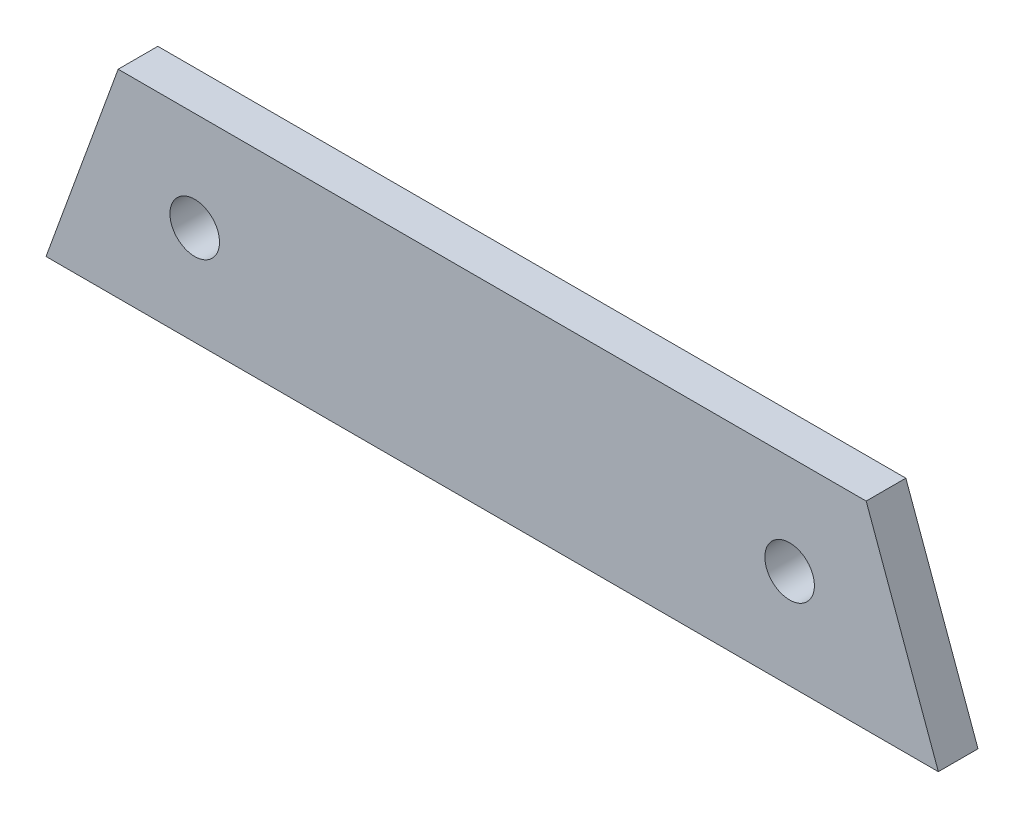
ISO-10303-21;
HEADER;
FILE_DESCRIPTION(('STEP AP214'),'2;1');
FILE_NAME('part.step','',(''),(''),'','','');
FILE_SCHEMA(('AUTOMOTIVE_DESIGN { 1 0 10303 214 1 1 1 1 }'));
ENDSEC;
DATA;
#1=APPLICATION_CONTEXT('core data for automotive mechanical design processes');
#2=APPLICATION_PROTOCOL_DEFINITION('international standard','automotive_design',2000,#1);
#3=PRODUCT_CONTEXT('',#1,'mechanical');
#4=PRODUCT('Part','Part','',(#3));
#5=PRODUCT_RELATED_PRODUCT_CATEGORY('part','',(#4));
#6=PRODUCT_DEFINITION_FORMATION('','',#4);
#7=PRODUCT_DEFINITION_CONTEXT('part definition',#1,'design');
#8=PRODUCT_DEFINITION('design','',#6,#7);
#9=PRODUCT_DEFINITION_SHAPE('','',#8);
#10=(LENGTH_UNIT() NAMED_UNIT(*) SI_UNIT(.MILLI.,.METRE.));
#11=(NAMED_UNIT(*) PLANE_ANGLE_UNIT() SI_UNIT($,.RADIAN.));
#12=(NAMED_UNIT(*) SI_UNIT($,.STERADIAN.) SOLID_ANGLE_UNIT());
#13=UNCERTAINTY_MEASURE_WITH_UNIT(LENGTH_MEASURE(1.E-05),#10,'distance_accuracy_value','');
#14=(GEOMETRIC_REPRESENTATION_CONTEXT(3) GLOBAL_UNCERTAINTY_ASSIGNED_CONTEXT((#13)) GLOBAL_UNIT_ASSIGNED_CONTEXT((#10,
#11,#12)) REPRESENTATION_CONTEXT('',''));
#15=CARTESIAN_POINT('',(0.,0.,0.));
#16=DIRECTION('',(0.,0.,1.));
#17=DIRECTION('',(1.,0.,0.));
#18=AXIS2_PLACEMENT_3D('',#15,#16,#17);
#19=CARTESIAN_POINT('',(0.,0.,4.));
#20=DIRECTION('',(0.,0.,1.));
#21=DIRECTION('',(1.,0.,0.));
#22=AXIS2_PLACEMENT_3D('',#19,#20,#21);
#23=PLANE('',#22);
#24=CARTESIAN_POINT('',(30.,10.,4.));
#25=DIRECTION('',(0.,0.,-1.));
#26=DIRECTION('',(-1.,0.,0.));
#27=AXIS2_PLACEMENT_3D('',#24,#25,#26);
#28=CIRCLE('',#27,2.5);
#29=CARTESIAN_POINT('',(27.5,10.,4.));
#30=VERTEX_POINT('',#29);
#31=EDGE_CURVE('E82',#30,#30,#28,.T.);
#32=ORIENTED_EDGE('',*,*,#31,.T.);
#33=EDGE_LOOP('',(#32));
#34=FACE_BOUND('',#33,.T.);
#35=DIRECTION('',(0.342020143325672,-0.939692620785907,0.));
#36=VECTOR('',#35,1.);
#37=CARTESIAN_POINT('',(45.,0.,4.));
#38=LINE('',#37,#36);
#39=CARTESIAN_POINT('',(45.,0.,4.));
#40=VERTEX_POINT('',#39);
#41=CARTESIAN_POINT('',(37.7205953146759,20.,4.));
#42=VERTEX_POINT('',#41);
#43=EDGE_CURVE('E55',#40,#42,#38,.F.);
#44=ORIENTED_EDGE('',*,*,#43,.T.);
#45=DIRECTION('',(1.,0.,0.));
#46=VECTOR('',#45,1.);
#47=CARTESIAN_POINT('',(37.7205953146759,20.,4.));
#48=LINE('',#47,#46);
#49=CARTESIAN_POINT('',(-37.7205953146759,20.,4.));
#50=VERTEX_POINT('',#49);
#51=EDGE_CURVE('E96',#42,#50,#48,.F.);
#52=ORIENTED_EDGE('',*,*,#51,.T.);
#53=DIRECTION('',(0.342020143325672,0.939692620785907,0.));
#54=VECTOR('',#53,1.);
#55=CARTESIAN_POINT('',(-37.7205953146759,20.,4.));
#56=LINE('',#55,#54);
#57=CARTESIAN_POINT('',(-45.,0.,4.));
#58=VERTEX_POINT('',#57);
#59=EDGE_CURVE('E60',#50,#58,#56,.F.);
#60=ORIENTED_EDGE('',*,*,#59,.T.);
#61=DIRECTION('',(-1.,0.,0.));
#62=VECTOR('',#61,1.);
#63=CARTESIAN_POINT('',(-45.,0.,4.));
#64=LINE('',#63,#62);
#65=EDGE_CURVE('E58',#58,#40,#64,.F.);
#66=ORIENTED_EDGE('',*,*,#65,.T.);
#67=EDGE_LOOP('',(#44,#52,#60,#66));
#68=FACE_BOUND('',#67,.T.);
#69=CARTESIAN_POINT('',(-30.,10.,4.));
#70=DIRECTION('',(0.,0.,-1.));
#71=DIRECTION('',(-1.,0.,0.));
#72=AXIS2_PLACEMENT_3D('',#69,#70,#71);
#73=CIRCLE('',#72,2.5);
#74=CARTESIAN_POINT('',(-32.5,10.,4.));
#75=VERTEX_POINT('',#74);
#76=EDGE_CURVE('E19',#75,#75,#73,.T.);
#77=ORIENTED_EDGE('',*,*,#76,.T.);
#78=EDGE_LOOP('',(#77));
#79=FACE_BOUND('',#78,.T.);
#80=ADVANCED_FACE('F16',(#34,#68,#79),#23,.T.);
#81=CARTESIAN_POINT('',(-45.,0.,4.));
#82=DIRECTION('',(0.,1.,0.));
#83=DIRECTION('',(-1.,0.,0.));
#84=AXIS2_PLACEMENT_3D('',#81,#82,#83);
#85=PLANE('',#84);
#86=DIRECTION('',(0.,0.,1.));
#87=VECTOR('',#86,1.);
#88=CARTESIAN_POINT('',(45.,0.,4.));
#89=LINE('',#88,#87);
#90=CARTESIAN_POINT('',(45.,0.,0.));
#91=VERTEX_POINT('',#90);
#92=EDGE_CURVE('E65',#91,#40,#89,.T.);
#93=ORIENTED_EDGE('',*,*,#92,.T.);
#94=ORIENTED_EDGE('',*,*,#65,.F.);
#95=DIRECTION('',(0.,0.,1.));
#96=VECTOR('',#95,1.);
#97=CARTESIAN_POINT('',(-45.,0.,4.));
#98=LINE('',#97,#96);
#99=CARTESIAN_POINT('',(-45.,0.,0.));
#100=VERTEX_POINT('',#99);
#101=EDGE_CURVE('E89',#58,#100,#98,.F.);
#102=ORIENTED_EDGE('',*,*,#101,.T.);
#103=DIRECTION('',(1.,0.,0.));
#104=VECTOR('',#103,1.);
#105=CARTESIAN_POINT('',(0.,0.,0.));
#106=LINE('',#105,#104);
#107=EDGE_CURVE('E76',#100,#91,#106,.T.);
#108=ORIENTED_EDGE('',*,*,#107,.T.);
#109=EDGE_LOOP('',(#93,#94,#102,#108));
#110=FACE_BOUND('',#109,.T.);
#111=ADVANCED_FACE('F75',(#110),#85,.F.);
#112=CARTESIAN_POINT('',(45.,0.,4.));
#113=DIRECTION('',(-0.939692620785907,-0.342020143325672,0.));
#114=DIRECTION('',(0.342020143325672,-0.939692620785907,0.));
#115=AXIS2_PLACEMENT_3D('',#112,#113,#114);
#116=PLANE('',#115);
#117=DIRECTION('',(0.,0.,-1.));
#118=VECTOR('',#117,1.);
#119=CARTESIAN_POINT('',(37.7205953146759,20.,4.));
#120=LINE('',#119,#118);
#121=CARTESIAN_POINT('',(37.7205953146759,20.,0.));
#122=VERTEX_POINT('',#121);
#123=EDGE_CURVE('E72',#122,#42,#120,.F.);
#124=ORIENTED_EDGE('',*,*,#123,.T.);
#125=ORIENTED_EDGE('',*,*,#43,.F.);
#126=ORIENTED_EDGE('',*,*,#92,.F.);
#127=DIRECTION('',(-0.342020143325672,0.939692620785907,0.));
#128=VECTOR('',#127,1.);
#129=CARTESIAN_POINT('',(45.,0.,0.));
#130=LINE('',#129,#128);
#131=EDGE_CURVE('E86',#91,#122,#130,.T.);
#132=ORIENTED_EDGE('',*,*,#131,.T.);
#133=EDGE_LOOP('',(#124,#125,#126,#132));
#134=FACE_BOUND('',#133,.T.);
#135=ADVANCED_FACE('F69',(#134),#116,.F.);
#136=CARTESIAN_POINT('',(37.7205953146759,20.,4.));
#137=DIRECTION('',(0.,-1.,0.));
#138=DIRECTION('',(0.,0.,-1.));
#139=AXIS2_PLACEMENT_3D('',#136,#137,#138);
#140=PLANE('',#139);
#141=DIRECTION('',(0.,0.,1.));
#142=VECTOR('',#141,1.);
#143=CARTESIAN_POINT('',(-37.7205953146759,20.,4.));
#144=LINE('',#143,#142);
#145=CARTESIAN_POINT('',(-37.7205953146759,20.,0.));
#146=VERTEX_POINT('',#145);
#147=EDGE_CURVE('E34',#146,#50,#144,.T.);
#148=ORIENTED_EDGE('',*,*,#147,.T.);
#149=ORIENTED_EDGE('',*,*,#51,.F.);
#150=ORIENTED_EDGE('',*,*,#123,.F.);
#151=DIRECTION('',(1.,0.,0.));
#152=VECTOR('',#151,1.);
#153=CARTESIAN_POINT('',(0.,20.,0.));
#154=LINE('',#153,#152);
#155=EDGE_CURVE('E102',#122,#146,#154,.F.);
#156=ORIENTED_EDGE('',*,*,#155,.T.);
#157=EDGE_LOOP('',(#148,#149,#150,#156));
#158=FACE_BOUND('',#157,.T.);
#159=ADVANCED_FACE('F100',(#158),#140,.F.);
#160=CARTESIAN_POINT('',(-37.7205953146759,20.,4.));
#161=DIRECTION('',(0.939692620785907,-0.342020143325672,0.));
#162=DIRECTION('',(0.342020143325672,0.939692620785907,0.));
#163=AXIS2_PLACEMENT_3D('',#160,#161,#162);
#164=PLANE('',#163);
#165=ORIENTED_EDGE('',*,*,#101,.F.);
#166=ORIENTED_EDGE('',*,*,#59,.F.);
#167=ORIENTED_EDGE('',*,*,#147,.F.);
#168=DIRECTION('',(-0.342020143325672,-0.939692620785907,0.));
#169=VECTOR('',#168,1.);
#170=CARTESIAN_POINT('',(-37.7205953146759,20.,0.));
#171=LINE('',#170,#169);
#172=EDGE_CURVE('E81',#146,#100,#171,.T.);
#173=ORIENTED_EDGE('',*,*,#172,.T.);
#174=EDGE_LOOP('',(#165,#166,#167,#173));
#175=FACE_BOUND('',#174,.T.);
#176=ADVANCED_FACE('F98',(#175),#164,.F.);
#177=CARTESIAN_POINT('',(-30.,10.,4.));
#178=DIRECTION('',(0.,0.,-1.));
#179=DIRECTION('',(-1.,0.,0.));
#180=AXIS2_PLACEMENT_3D('',#177,#178,#179);
#181=CYLINDRICAL_SURFACE('',#180,2.5);
#182=CARTESIAN_POINT('',(-30.,10.,0.));
#183=DIRECTION('',(0.,0.,-1.));
#184=DIRECTION('',(-1.,0.,0.));
#185=AXIS2_PLACEMENT_3D('',#182,#183,#184);
#186=CIRCLE('',#185,2.5);
#187=CARTESIAN_POINT('',(-32.5,10.,0.));
#188=VERTEX_POINT('',#187);
#189=EDGE_CURVE('E25',#188,#188,#186,.T.);
#190=ORIENTED_EDGE('',*,*,#189,.T.);
#191=EDGE_LOOP('',(#190));
#192=FACE_BOUND('',#191,.T.);
#193=ORIENTED_EDGE('',*,*,#76,.F.);
#194=EDGE_LOOP('',(#193));
#195=FACE_BOUND('',#194,.T.);
#196=ADVANCED_FACE('F116',(#192,#195),#181,.F.);
#197=CARTESIAN_POINT('',(30.,10.,4.));
#198=DIRECTION('',(0.,0.,-1.));
#199=DIRECTION('',(-1.,0.,0.));
#200=AXIS2_PLACEMENT_3D('',#197,#198,#199);
#201=CYLINDRICAL_SURFACE('',#200,2.5);
#202=CARTESIAN_POINT('',(30.,10.,0.));
#203=DIRECTION('',(0.,0.,-1.));
#204=DIRECTION('',(-1.,0.,0.));
#205=AXIS2_PLACEMENT_3D('',#202,#203,#204);
#206=CIRCLE('',#205,2.5);
#207=CARTESIAN_POINT('',(27.5,10.,0.));
#208=VERTEX_POINT('',#207);
#209=EDGE_CURVE('E11',#208,#208,#206,.T.);
#210=ORIENTED_EDGE('',*,*,#209,.T.);
#211=EDGE_LOOP('',(#210));
#212=FACE_BOUND('',#211,.T.);
#213=ORIENTED_EDGE('',*,*,#31,.F.);
#214=EDGE_LOOP('',(#213));
#215=FACE_BOUND('',#214,.T.);
#216=ADVANCED_FACE('F108',(#212,#215),#201,.F.);
#217=CARTESIAN_POINT('',(0.,0.,0.));
#218=DIRECTION('',(0.,0.,1.));
#219=DIRECTION('',(1.,0.,0.));
#220=AXIS2_PLACEMENT_3D('',#217,#218,#219);
#221=PLANE('',#220);
#222=ORIENTED_EDGE('',*,*,#209,.F.);
#223=EDGE_LOOP('',(#222));
#224=FACE_BOUND('',#223,.T.);
#225=ORIENTED_EDGE('',*,*,#189,.F.);
#226=EDGE_LOOP('',(#225));
#227=FACE_BOUND('',#226,.T.);
#228=ORIENTED_EDGE('',*,*,#155,.F.);
#229=ORIENTED_EDGE('',*,*,#131,.F.);
#230=ORIENTED_EDGE('',*,*,#107,.F.);
#231=ORIENTED_EDGE('',*,*,#172,.F.);
#232=EDGE_LOOP('',(#228,#229,#230,#231));
#233=FACE_BOUND('',#232,.T.);
#234=ADVANCED_FACE('F106',(#224,#227,#233),#221,.F.);
#235=CLOSED_SHELL('',(#80,#111,#135,#159,#176,#196,#216,#234));
#236=MANIFOLD_SOLID_BREP('B1',#235);
#237=ADVANCED_BREP_SHAPE_REPRESENTATION('',(#18,#236),#14);
#238=SHAPE_DEFINITION_REPRESENTATION(#9,#237);
ENDSEC;
END-ISO-10303-21;
